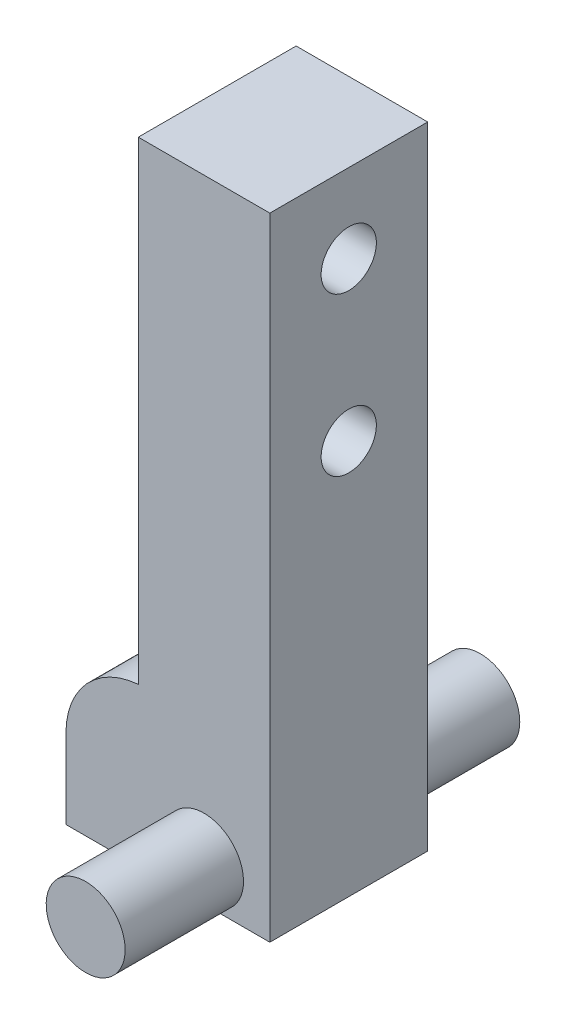
ISO-10303-21;
HEADER;
FILE_DESCRIPTION(('STEP AP214'),'2;1');
FILE_NAME('part.step','',(''),(''),'','','');
FILE_SCHEMA(('AUTOMOTIVE_DESIGN { 1 0 10303 214 1 1 1 1 }'));
ENDSEC;
DATA;
#1=APPLICATION_CONTEXT('core data for automotive mechanical design processes');
#2=APPLICATION_PROTOCOL_DEFINITION('international standard','automotive_design',2000,#1);
#3=PRODUCT_CONTEXT('',#1,'mechanical');
#4=PRODUCT('Part','Part','',(#3));
#5=PRODUCT_RELATED_PRODUCT_CATEGORY('part','',(#4));
#6=PRODUCT_DEFINITION_FORMATION('','',#4);
#7=PRODUCT_DEFINITION_CONTEXT('part definition',#1,'design');
#8=PRODUCT_DEFINITION('design','',#6,#7);
#9=PRODUCT_DEFINITION_SHAPE('','',#8);
#10=(LENGTH_UNIT() NAMED_UNIT(*) SI_UNIT(.MILLI.,.METRE.));
#11=(NAMED_UNIT(*) PLANE_ANGLE_UNIT() SI_UNIT($,.RADIAN.));
#12=(NAMED_UNIT(*) SI_UNIT($,.STERADIAN.) SOLID_ANGLE_UNIT());
#13=UNCERTAINTY_MEASURE_WITH_UNIT(LENGTH_MEASURE(1.E-05),#10,'distance_accuracy_value','');
#14=(GEOMETRIC_REPRESENTATION_CONTEXT(3) GLOBAL_UNCERTAINTY_ASSIGNED_CONTEXT((#13)) GLOBAL_UNIT_ASSIGNED_CONTEXT((#10,
#11,#12)) REPRESENTATION_CONTEXT('',''));
#15=CARTESIAN_POINT('',(0.,0.,0.));
#16=DIRECTION('',(0.,0.,1.));
#17=DIRECTION('',(1.,0.,0.));
#18=AXIS2_PLACEMENT_3D('',#15,#16,#17);
#19=CARTESIAN_POINT('',(0.,0.,-12.));
#20=DIRECTION('',(-1.,0.,0.));
#21=DIRECTION('',(0.,-1.,0.));
#22=AXIS2_PLACEMENT_3D('',#19,#20,#21);
#23=PLANE('',#22);
#24=DIRECTION('',(0.,1.,0.));
#25=VECTOR('',#24,1.);
#26=CARTESIAN_POINT('',(0.,0.,0.));
#27=LINE('',#26,#25);
#28=CARTESIAN_POINT('',(0.,0.,0.));
#29=VERTEX_POINT('',#28);
#30=CARTESIAN_POINT('',(0.,48.,0.));
#31=VERTEX_POINT('',#30);
#32=EDGE_CURVE('E146',#29,#31,#27,.T.);
#33=ORIENTED_EDGE('',*,*,#32,.F.);
#34=DIRECTION('',(0.,0.,1.));
#35=VECTOR('',#34,1.);
#36=CARTESIAN_POINT('',(0.,0.,-12.));
#37=LINE('',#36,#35);
#38=CARTESIAN_POINT('',(0.,0.,-12.));
#39=VERTEX_POINT('',#38);
#40=EDGE_CURVE('E48',#39,#29,#37,.T.);
#41=ORIENTED_EDGE('',*,*,#40,.F.);
#42=DIRECTION('',(0.,1.,0.));
#43=VECTOR('',#42,1.);
#44=CARTESIAN_POINT('',(0.,0.,-12.));
#45=LINE('',#44,#43);
#46=CARTESIAN_POINT('',(0.,48.,-12.));
#47=VERTEX_POINT('',#46);
#48=EDGE_CURVE('E117',#39,#47,#45,.T.);
#49=ORIENTED_EDGE('',*,*,#48,.T.);
#50=DIRECTION('',(0.,0.,1.));
#51=VECTOR('',#50,1.);
#52=CARTESIAN_POINT('',(0.,48.,-12.));
#53=LINE('',#52,#51);
#54=EDGE_CURVE('E113',#47,#31,#53,.T.);
#55=ORIENTED_EDGE('',*,*,#54,.T.);
#56=EDGE_LOOP('',(#33,#41,#49,#55));
#57=FACE_BOUND('',#56,.T.);
#58=CARTESIAN_POINT('',(0.,42.,-6.));
#59=DIRECTION('',(1.,0.,0.));
#60=DIRECTION('',(0.,-1.,0.));
#61=AXIS2_PLACEMENT_3D('',#58,#59,#60);
#62=CIRCLE('',#61,2.1);
#63=CARTESIAN_POINT('',(0.,39.9,-6.));
#64=VERTEX_POINT('',#63);
#65=EDGE_CURVE('E226',#64,#64,#62,.F.);
#66=ORIENTED_EDGE('',*,*,#65,.T.);
#67=EDGE_LOOP('',(#66));
#68=FACE_BOUND('',#67,.T.);
#69=CARTESIAN_POINT('',(0.,30.,-6.));
#70=DIRECTION('',(1.,0.,0.));
#71=DIRECTION('',(0.,-1.,0.));
#72=AXIS2_PLACEMENT_3D('',#69,#70,#71);
#73=CIRCLE('',#72,2.1);
#74=CARTESIAN_POINT('',(0.,27.9,-6.));
#75=VERTEX_POINT('',#74);
#76=EDGE_CURVE('E221',#75,#75,#73,.F.);
#77=ORIENTED_EDGE('',*,*,#76,.T.);
#78=EDGE_LOOP('',(#77));
#79=FACE_BOUND('',#78,.T.);
#80=ADVANCED_FACE('F39',(#57,#68,#79),#23,.F.);
#81=CARTESIAN_POINT('',(-10.,48.,-12.));
#82=DIRECTION('',(1.,0.,0.));
#83=DIRECTION('',(0.,1.,0.));
#84=AXIS2_PLACEMENT_3D('',#81,#82,#83);
#85=PLANE('',#84);
#86=DIRECTION('',(0.,-1.,0.));
#87=VECTOR('',#86,1.);
#88=CARTESIAN_POINT('',(-10.,48.,0.));
#89=LINE('',#88,#87);
#90=CARTESIAN_POINT('',(-10.,48.,0.));
#91=VERTEX_POINT('',#90);
#92=CARTESIAN_POINT('',(-9.99999999999999,11.9791303715507,0.));
#93=VERTEX_POINT('',#92);
#94=EDGE_CURVE('E126',#91,#93,#89,.T.);
#95=ORIENTED_EDGE('',*,*,#94,.F.);
#96=DIRECTION('',(0.,0.,1.));
#97=VECTOR('',#96,1.);
#98=CARTESIAN_POINT('',(-10.,48.,-12.));
#99=LINE('',#98,#97);
#100=CARTESIAN_POINT('',(-10.,48.,-12.));
#101=VERTEX_POINT('',#100);
#102=EDGE_CURVE('E110',#101,#91,#99,.T.);
#103=ORIENTED_EDGE('',*,*,#102,.F.);
#104=DIRECTION('',(0.,-1.,0.));
#105=VECTOR('',#104,1.);
#106=CARTESIAN_POINT('',(-10.,48.,-12.));
#107=LINE('',#106,#105);
#108=CARTESIAN_POINT('',(-9.99999999999999,11.9791303715507,-12.));
#109=VERTEX_POINT('',#108);
#110=EDGE_CURVE('E116',#101,#109,#107,.T.);
#111=ORIENTED_EDGE('',*,*,#110,.T.);
#112=DIRECTION('',(0.,0.,1.));
#113=VECTOR('',#112,1.);
#114=CARTESIAN_POINT('',(-9.99999999999999,11.9791303715507,-12.));
#115=LINE('',#114,#113);
#116=EDGE_CURVE('E127',#109,#93,#115,.T.);
#117=ORIENTED_EDGE('',*,*,#116,.T.);
#118=EDGE_LOOP('',(#95,#103,#111,#117));
#119=FACE_BOUND('',#118,.T.);
#120=CARTESIAN_POINT('',(-9.9999999999909,42.,-6.));
#121=DIRECTION('',(1.,0.,0.));
#122=DIRECTION('',(0.,0.,-1.));
#123=AXIS2_PLACEMENT_3D('',#120,#121,#122);
#124=CIRCLE('',#123,2.1);
#125=CARTESIAN_POINT('',(-9.9999999999909,42.,-8.1));
#126=VERTEX_POINT('',#125);
#127=EDGE_CURVE('E223',#126,#126,#124,.T.);
#128=ORIENTED_EDGE('',*,*,#127,.T.);
#129=EDGE_LOOP('',(#128));
#130=FACE_BOUND('',#129,.T.);
#131=CARTESIAN_POINT('',(-9.99999999999091,30.,-6.));
#132=DIRECTION('',(1.,0.,0.));
#133=DIRECTION('',(0.,0.,-1.));
#134=AXIS2_PLACEMENT_3D('',#131,#132,#133);
#135=CIRCLE('',#134,2.1);
#136=CARTESIAN_POINT('',(-9.99999999999091,30.,-8.1));
#137=VERTEX_POINT('',#136);
#138=EDGE_CURVE('E218',#137,#137,#135,.T.);
#139=ORIENTED_EDGE('',*,*,#138,.T.);
#140=EDGE_LOOP('',(#139));
#141=FACE_BOUND('',#140,.T.);
#142=ADVANCED_FACE('F124',(#119,#130,#141),#85,.F.);
#143=CARTESIAN_POINT('',(-15.5,6.,-12.));
#144=DIRECTION('',(1.,0.,0.));
#145=DIRECTION('',(0.,0.,1.));
#146=AXIS2_PLACEMENT_3D('',#143,#144,#145);
#147=PLANE('',#146);
#148=DIRECTION('',(0.,-1.,0.));
#149=VECTOR('',#148,1.);
#150=CARTESIAN_POINT('',(-15.5,6.,0.));
#151=LINE('',#150,#149);
#152=CARTESIAN_POINT('',(-15.5,6.,0.));
#153=VERTEX_POINT('',#152);
#154=CARTESIAN_POINT('',(-15.5,0.,0.));
#155=VERTEX_POINT('',#154);
#156=EDGE_CURVE('E160',#153,#155,#151,.T.);
#157=ORIENTED_EDGE('',*,*,#156,.F.);
#158=DIRECTION('',(0.,0.,1.));
#159=VECTOR('',#158,1.);
#160=CARTESIAN_POINT('',(-15.5,6.,-12.));
#161=LINE('',#160,#159);
#162=CARTESIAN_POINT('',(-15.5,6.,-12.));
#163=VERTEX_POINT('',#162);
#164=EDGE_CURVE('E130',#163,#153,#161,.T.);
#165=ORIENTED_EDGE('',*,*,#164,.F.);
#166=DIRECTION('',(0.,-1.,0.));
#167=VECTOR('',#166,1.);
#168=CARTESIAN_POINT('',(-15.5,6.,-12.));
#169=LINE('',#168,#167);
#170=CARTESIAN_POINT('',(-15.5,0.,-12.));
#171=VERTEX_POINT('',#170);
#172=EDGE_CURVE('E156',#163,#171,#169,.T.);
#173=ORIENTED_EDGE('',*,*,#172,.T.);
#174=DIRECTION('',(0.,0.,1.));
#175=VECTOR('',#174,1.);
#176=CARTESIAN_POINT('',(-15.5,0.,-12.));
#177=LINE('',#176,#175);
#178=EDGE_CURVE('E11',#171,#155,#177,.T.);
#179=ORIENTED_EDGE('',*,*,#178,.T.);
#180=EDGE_LOOP('',(#157,#165,#173,#179));
#181=FACE_BOUND('',#180,.T.);
#182=ADVANCED_FACE('F41',(#181),#147,.F.);
#183=CARTESIAN_POINT('',(-15.5,0.,-12.));
#184=DIRECTION('',(0.,1.,0.));
#185=DIRECTION('',(0.,0.,-1.));
#186=AXIS2_PLACEMENT_3D('',#183,#184,#185);
#187=PLANE('',#186);
#188=DIRECTION('',(1.,0.,0.));
#189=VECTOR('',#188,1.);
#190=CARTESIAN_POINT('',(-15.5,0.,0.));
#191=LINE('',#190,#189);
#192=CARTESIAN_POINT('',(-5.,0.,0.));
#193=VERTEX_POINT('',#192);
#194=EDGE_CURVE('E149',#155,#193,#191,.T.);
#195=ORIENTED_EDGE('',*,*,#194,.F.);
#196=ORIENTED_EDGE('',*,*,#178,.F.);
#197=DIRECTION('',(1.,0.,0.));
#198=VECTOR('',#197,1.);
#199=CARTESIAN_POINT('',(-15.5,0.,-12.));
#200=LINE('',#199,#198);
#201=CARTESIAN_POINT('',(-5.,0.,-12.));
#202=VERTEX_POINT('',#201);
#203=EDGE_CURVE('E94',#171,#202,#200,.T.);
#204=ORIENTED_EDGE('',*,*,#203,.T.);
#205=EDGE_CURVE('E143',#202,#39,#200,.T.);
#206=ORIENTED_EDGE('',*,*,#205,.T.);
#207=ORIENTED_EDGE('',*,*,#40,.T.);
#208=EDGE_CURVE('E140',#193,#29,#191,.T.);
#209=ORIENTED_EDGE('',*,*,#208,.F.);
#210=EDGE_LOOP('',(#195,#196,#204,#206,#207,#209));
#211=FACE_BOUND('',#210,.T.);
#212=ADVANCED_FACE('F139',(#211),#187,.F.);
#213=CARTESIAN_POINT('',(0.,48.,-12.));
#214=DIRECTION('',(0.,-1.,0.));
#215=DIRECTION('',(0.,0.,1.));
#216=AXIS2_PLACEMENT_3D('',#213,#214,#215);
#217=PLANE('',#216);
#218=DIRECTION('',(-1.,0.,0.));
#219=VECTOR('',#218,1.);
#220=CARTESIAN_POINT('',(0.,48.,0.));
#221=LINE('',#220,#219);
#222=EDGE_CURVE('E148',#31,#91,#221,.T.);
#223=ORIENTED_EDGE('',*,*,#222,.F.);
#224=ORIENTED_EDGE('',*,*,#54,.F.);
#225=DIRECTION('',(-1.,0.,0.));
#226=VECTOR('',#225,1.);
#227=CARTESIAN_POINT('',(0.,48.,-12.));
#228=LINE('',#227,#226);
#229=EDGE_CURVE('E106',#47,#101,#228,.T.);
#230=ORIENTED_EDGE('',*,*,#229,.T.);
#231=ORIENTED_EDGE('',*,*,#102,.T.);
#232=EDGE_LOOP('',(#223,#224,#230,#231));
#233=FACE_BOUND('',#232,.T.);
#234=ADVANCED_FACE('F108',(#233),#217,.F.);
#235=CARTESIAN_POINT('',(-9.5,6.,-12.));
#236=DIRECTION('',(0.,0.,1.));
#237=DIRECTION('',(-1.,0.,0.));
#238=AXIS2_PLACEMENT_3D('',#235,#236,#237);
#239=CYLINDRICAL_SURFACE('',#238,6.);
#240=CARTESIAN_POINT('',(-9.5,6.,0.));
#241=DIRECTION('',(0.,0.,1.));
#242=DIRECTION('',(-1.,0.,0.));
#243=AXIS2_PLACEMENT_3D('',#240,#241,#242);
#244=CIRCLE('',#243,6.);
#245=EDGE_CURVE('E87',#93,#153,#244,.T.);
#246=ORIENTED_EDGE('',*,*,#245,.F.);
#247=ORIENTED_EDGE('',*,*,#116,.F.);
#248=CARTESIAN_POINT('',(-9.5,6.,-12.));
#249=DIRECTION('',(0.,0.,1.));
#250=DIRECTION('',(-1.,0.,0.));
#251=AXIS2_PLACEMENT_3D('',#248,#249,#250);
#252=CIRCLE('',#251,6.);
#253=EDGE_CURVE('E60',#109,#163,#252,.T.);
#254=ORIENTED_EDGE('',*,*,#253,.T.);
#255=ORIENTED_EDGE('',*,*,#164,.T.);
#256=EDGE_LOOP('',(#246,#247,#254,#255));
#257=FACE_BOUND('',#256,.T.);
#258=ADVANCED_FACE('F185',(#257),#239,.T.);
#259=CARTESIAN_POINT('',(-9.5,6.,-12.));
#260=DIRECTION('',(0.,0.,1.));
#261=DIRECTION('',(-1.,0.,0.));
#262=AXIS2_PLACEMENT_3D('',#259,#260,#261);
#263=PLANE('',#262);
#264=ORIENTED_EDGE('',*,*,#203,.F.);
#265=ORIENTED_EDGE('',*,*,#172,.F.);
#266=ORIENTED_EDGE('',*,*,#253,.F.);
#267=ORIENTED_EDGE('',*,*,#110,.F.);
#268=ORIENTED_EDGE('',*,*,#229,.F.);
#269=ORIENTED_EDGE('',*,*,#48,.F.);
#270=ORIENTED_EDGE('',*,*,#205,.F.);
#271=CARTESIAN_POINT('',(-5.,3.,-12.));
#272=DIRECTION('',(0.,0.,-1.));
#273=DIRECTION('',(-1.,0.,0.));
#274=AXIS2_PLACEMENT_3D('',#271,#272,#273);
#275=CIRCLE('',#274,3.);
#276=EDGE_CURVE('E161',#202,#202,#275,.F.);
#277=ORIENTED_EDGE('',*,*,#276,.T.);
#278=EDGE_LOOP('',(#264,#265,#266,#267,#268,#269,#270,#277));
#279=FACE_BOUND('',#278,.T.);
#280=ADVANCED_FACE('F120',(#279),#263,.F.);
#281=CARTESIAN_POINT('',(-9.5,6.,0.));
#282=DIRECTION('',(0.,0.,1.));
#283=DIRECTION('',(-1.,0.,0.));
#284=AXIS2_PLACEMENT_3D('',#281,#282,#283);
#285=PLANE('',#284);
#286=ORIENTED_EDGE('',*,*,#208,.T.);
#287=ORIENTED_EDGE('',*,*,#32,.T.);
#288=ORIENTED_EDGE('',*,*,#222,.T.);
#289=ORIENTED_EDGE('',*,*,#94,.T.);
#290=ORIENTED_EDGE('',*,*,#245,.T.);
#291=ORIENTED_EDGE('',*,*,#156,.T.);
#292=ORIENTED_EDGE('',*,*,#194,.T.);
#293=CARTESIAN_POINT('',(-5.,3.,0.));
#294=DIRECTION('',(0.,0.,-1.));
#295=DIRECTION('',(-1.,0.,0.));
#296=AXIS2_PLACEMENT_3D('',#293,#294,#295);
#297=CIRCLE('',#296,3.);
#298=EDGE_CURVE('E43',#193,#193,#297,.F.);
#299=ORIENTED_EDGE('',*,*,#298,.F.);
#300=EDGE_LOOP('',(#286,#287,#288,#289,#290,#291,#292,#299));
#301=FACE_BOUND('',#300,.T.);
#302=ADVANCED_FACE('F189',(#301),#285,.T.);
#303=CARTESIAN_POINT('',(-5.,3.,9.));
#304=DIRECTION('',(0.,0.,-1.));
#305=DIRECTION('',(1.,0.,0.));
#306=AXIS2_PLACEMENT_3D('',#303,#304,#305);
#307=PLANE('',#306);
#308=CARTESIAN_POINT('',(-5.,3.,9.));
#309=DIRECTION('',(0.,0.,1.));
#310=DIRECTION('',(1.,0.,0.));
#311=AXIS2_PLACEMENT_3D('',#308,#309,#310);
#312=CIRCLE('',#311,3.);
#313=CARTESIAN_POINT('',(-2.,3.,9.));
#314=VERTEX_POINT('',#313);
#315=EDGE_CURVE('E167',#314,#314,#312,.T.);
#316=ORIENTED_EDGE('',*,*,#315,.T.);
#317=EDGE_LOOP('',(#316));
#318=FACE_BOUND('',#317,.T.);
#319=ADVANCED_FACE('F192',(#318),#307,.F.);
#320=CARTESIAN_POINT('',(-5.,3.,-21.));
#321=DIRECTION('',(0.,0.,1.));
#322=DIRECTION('',(-1.,0.,0.));
#323=AXIS2_PLACEMENT_3D('',#320,#321,#322);
#324=CYLINDRICAL_SURFACE('',#323,3.);
#325=ORIENTED_EDGE('',*,*,#298,.T.);
#326=EDGE_LOOP('',(#325));
#327=FACE_BOUND('',#326,.T.);
#328=ORIENTED_EDGE('',*,*,#315,.F.);
#329=EDGE_LOOP('',(#328));
#330=FACE_BOUND('',#329,.T.);
#331=ADVANCED_FACE('F195',(#327,#330),#324,.T.);
#332=CARTESIAN_POINT('',(-5.,3.,-21.));
#333=DIRECTION('',(0.,0.,1.));
#334=DIRECTION('',(1.,0.,0.));
#335=AXIS2_PLACEMENT_3D('',#332,#333,#334);
#336=CIRCLE('',#335,3.);
#337=CARTESIAN_POINT('',(-2.,3.,-21.));
#338=VERTEX_POINT('',#337);
#339=EDGE_CURVE('E164',#338,#338,#336,.T.);
#340=ORIENTED_EDGE('',*,*,#339,.T.);
#341=EDGE_LOOP('',(#340));
#342=FACE_BOUND('',#341,.T.);
#343=ORIENTED_EDGE('',*,*,#276,.F.);
#344=EDGE_LOOP('',(#343));
#345=FACE_BOUND('',#344,.T.);
#346=ADVANCED_FACE('F198',(#342,#345),#324,.T.);
#347=CARTESIAN_POINT('',(-5.,3.,-21.));
#348=DIRECTION('',(0.,0.,-1.));
#349=DIRECTION('',(1.,0.,0.));
#350=AXIS2_PLACEMENT_3D('',#347,#348,#349);
#351=PLANE('',#350);
#352=ORIENTED_EDGE('',*,*,#339,.F.);
#353=EDGE_LOOP('',(#352));
#354=FACE_BOUND('',#353,.T.);
#355=ADVANCED_FACE('F202',(#354),#351,.T.);
#356=CARTESIAN_POINT('',(-9.9999999999909,42.,-6.));
#357=DIRECTION('',(-1.,0.,0.));
#358=DIRECTION('',(0.,0.,-1.));
#359=AXIS2_PLACEMENT_3D('',#356,#357,#358);
#360=CYLINDRICAL_SURFACE('',#359,2.1);
#361=ORIENTED_EDGE('',*,*,#127,.F.);
#362=EDGE_LOOP('',(#361));
#363=FACE_BOUND('',#362,.T.);
#364=ORIENTED_EDGE('',*,*,#65,.F.);
#365=EDGE_LOOP('',(#364));
#366=FACE_BOUND('',#365,.T.);
#367=ADVANCED_FACE('F205',(#363,#366),#360,.F.);
#368=CARTESIAN_POINT('',(-9.99999999999091,30.,-6.));
#369=DIRECTION('',(-1.,0.,0.));
#370=DIRECTION('',(0.,0.,-1.));
#371=AXIS2_PLACEMENT_3D('',#368,#369,#370);
#372=CYLINDRICAL_SURFACE('',#371,2.1);
#373=ORIENTED_EDGE('',*,*,#138,.F.);
#374=EDGE_LOOP('',(#373));
#375=FACE_BOUND('',#374,.T.);
#376=ORIENTED_EDGE('',*,*,#76,.F.);
#377=EDGE_LOOP('',(#376));
#378=FACE_BOUND('',#377,.T.);
#379=ADVANCED_FACE('F209',(#375,#378),#372,.F.);
#380=CLOSED_SHELL('',(#80,#142,#182,#212,#234,#258,#280,#302,#319,#331,#346,#355,#367,#379));
#381=MANIFOLD_SOLID_BREP('B2',#380);
#382=ADVANCED_BREP_SHAPE_REPRESENTATION('',(#18,#381),#14);
#383=SHAPE_DEFINITION_REPRESENTATION(#9,#382);
ENDSEC;
END-ISO-10303-21;
